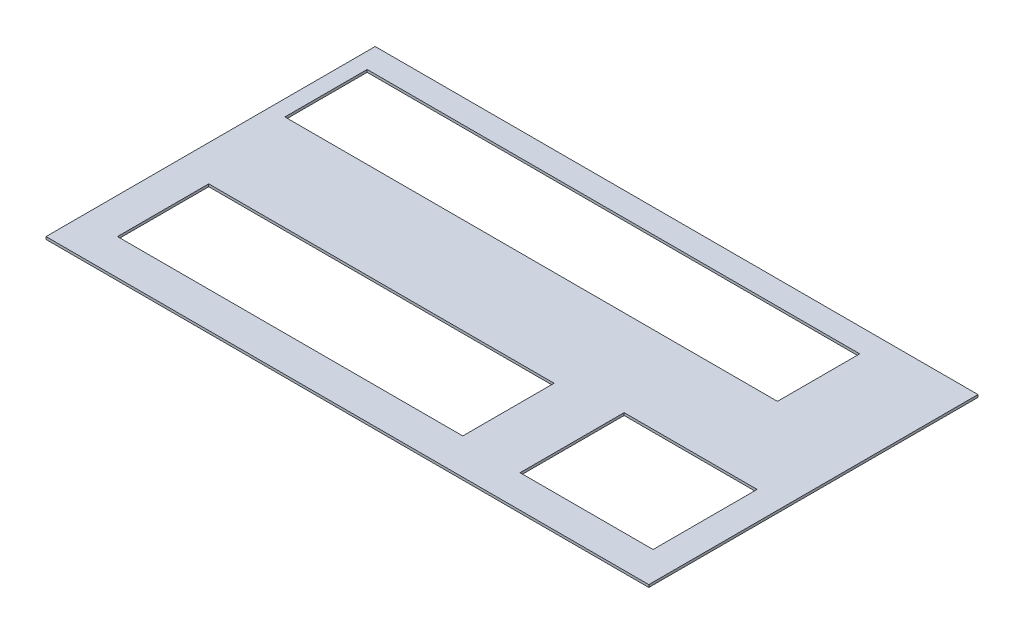
ISO-10303-21;
HEADER;
FILE_DESCRIPTION(('STEP AP214'),'2;1');
FILE_NAME('part.step','',(''),(''),'','','');
FILE_SCHEMA(('AUTOMOTIVE_DESIGN { 1 0 10303 214 1 1 1 1 }'));
ENDSEC;
DATA;
#1=APPLICATION_CONTEXT('core data for automotive mechanical design processes');
#2=APPLICATION_PROTOCOL_DEFINITION('international standard','automotive_design',2000,#1);
#3=PRODUCT_CONTEXT('',#1,'mechanical');
#4=PRODUCT('Part','Part','',(#3));
#5=PRODUCT_RELATED_PRODUCT_CATEGORY('part','',(#4));
#6=PRODUCT_DEFINITION_FORMATION('','',#4);
#7=PRODUCT_DEFINITION_CONTEXT('part definition',#1,'design');
#8=PRODUCT_DEFINITION('design','',#6,#7);
#9=PRODUCT_DEFINITION_SHAPE('','',#8);
#10=(LENGTH_UNIT() NAMED_UNIT(*) SI_UNIT(.MILLI.,.METRE.));
#11=(NAMED_UNIT(*) PLANE_ANGLE_UNIT() SI_UNIT($,.RADIAN.));
#12=(NAMED_UNIT(*) SI_UNIT($,.STERADIAN.) SOLID_ANGLE_UNIT());
#13=UNCERTAINTY_MEASURE_WITH_UNIT(LENGTH_MEASURE(1.E-05),#10,'distance_accuracy_value','');
#14=(GEOMETRIC_REPRESENTATION_CONTEXT(3) GLOBAL_UNCERTAINTY_ASSIGNED_CONTEXT((#13)) GLOBAL_UNIT_ASSIGNED_CONTEXT((#10,
#11,#12)) REPRESENTATION_CONTEXT('',''));
#15=CARTESIAN_POINT('',(0.,0.,0.));
#16=DIRECTION('',(0.,0.,1.));
#17=DIRECTION('',(1.,0.,0.));
#18=AXIS2_PLACEMENT_3D('',#15,#16,#17);
#19=CARTESIAN_POINT('',(0.,6.35,0.));
#20=DIRECTION('',(1.,0.,0.));
#21=DIRECTION('',(0.,0.,-1.));
#22=AXIS2_PLACEMENT_3D('',#19,#20,#21);
#23=PLANE('',#22);
#24=DIRECTION('',(0.,0.,1.));
#25=VECTOR('',#24,1.);
#26=CARTESIAN_POINT('',(0.,0.,0.));
#27=LINE('',#26,#25);
#28=CARTESIAN_POINT('',(0.,0.,-829.31));
#29=VERTEX_POINT('',#28);
#30=CARTESIAN_POINT('',(0.,0.,0.));
#31=VERTEX_POINT('',#30);
#32=EDGE_CURVE('E283',#29,#31,#27,.T.);
#33=ORIENTED_EDGE('',*,*,#32,.T.);
#34=DIRECTION('',(0.,-1.,0.));
#35=VECTOR('',#34,1.);
#36=CARTESIAN_POINT('',(0.,6.35,0.));
#37=LINE('',#36,#35);
#38=CARTESIAN_POINT('',(0.,6.35,0.));
#39=VERTEX_POINT('',#38);
#40=EDGE_CURVE('E11',#39,#31,#37,.T.);
#41=ORIENTED_EDGE('',*,*,#40,.F.);
#42=DIRECTION('',(0.,0.,1.));
#43=VECTOR('',#42,1.);
#44=CARTESIAN_POINT('',(0.,6.35,0.));
#45=LINE('',#44,#43);
#46=CARTESIAN_POINT('',(0.,6.35,-829.31));
#47=VERTEX_POINT('',#46);
#48=EDGE_CURVE('E284',#47,#39,#45,.T.);
#49=ORIENTED_EDGE('',*,*,#48,.F.);
#50=DIRECTION('',(0.,-1.,0.));
#51=VECTOR('',#50,1.);
#52=CARTESIAN_POINT('',(0.,6.35,-829.31));
#53=LINE('',#52,#51);
#54=EDGE_CURVE('E298',#47,#29,#53,.T.);
#55=ORIENTED_EDGE('',*,*,#54,.T.);
#56=EDGE_LOOP('',(#33,#41,#49,#55));
#57=FACE_BOUND('',#56,.T.);
#58=ADVANCED_FACE('F42',(#57),#23,.F.);
#59=CARTESIAN_POINT('',(0.,6.35,0.));
#60=DIRECTION('',(0.,0.,-1.));
#61=DIRECTION('',(-1.,0.,0.));
#62=AXIS2_PLACEMENT_3D('',#59,#60,#61);
#63=PLANE('',#62);
#64=DIRECTION('',(1.,0.,0.));
#65=VECTOR('',#64,1.);
#66=CARTESIAN_POINT('',(0.,0.,0.));
#67=LINE('',#66,#65);
#68=CARTESIAN_POINT('',(1518.68,0.,0.));
#69=VERTEX_POINT('',#68);
#70=EDGE_CURVE('E302',#31,#69,#67,.T.);
#71=ORIENTED_EDGE('',*,*,#70,.T.);
#72=DIRECTION('',(0.,-1.,0.));
#73=VECTOR('',#72,1.);
#74=CARTESIAN_POINT('',(1518.68,6.35,0.));
#75=LINE('',#74,#73);
#76=CARTESIAN_POINT('',(1518.68,6.35,0.));
#77=VERTEX_POINT('',#76);
#78=EDGE_CURVE('E50',#77,#69,#75,.T.);
#79=ORIENTED_EDGE('',*,*,#78,.F.);
#80=DIRECTION('',(1.,0.,0.));
#81=VECTOR('',#80,1.);
#82=CARTESIAN_POINT('',(0.,6.35,0.));
#83=LINE('',#82,#81);
#84=EDGE_CURVE('E288',#39,#77,#83,.T.);
#85=ORIENTED_EDGE('',*,*,#84,.F.);
#86=ORIENTED_EDGE('',*,*,#40,.T.);
#87=EDGE_LOOP('',(#71,#79,#85,#86));
#88=FACE_BOUND('',#87,.T.);
#89=ADVANCED_FACE('F337',(#88),#63,.F.);
#90=CARTESIAN_POINT('',(1518.68,6.35,0.));
#91=DIRECTION('',(-1.,0.,0.));
#92=DIRECTION('',(0.,0.,1.));
#93=AXIS2_PLACEMENT_3D('',#90,#91,#92);
#94=PLANE('',#93);
#95=DIRECTION('',(0.,0.,-1.));
#96=VECTOR('',#95,1.);
#97=CARTESIAN_POINT('',(1518.68,0.,0.));
#98=LINE('',#97,#96);
#99=CARTESIAN_POINT('',(1518.68,0.,-829.31));
#100=VERTEX_POINT('',#99);
#101=EDGE_CURVE('E305',#69,#100,#98,.T.);
#102=ORIENTED_EDGE('',*,*,#101,.T.);
#103=DIRECTION('',(0.,-1.,0.));
#104=VECTOR('',#103,1.);
#105=CARTESIAN_POINT('',(1518.68,6.35,-829.31));
#106=LINE('',#105,#104);
#107=CARTESIAN_POINT('',(1518.68,6.35,-829.31));
#108=VERTEX_POINT('',#107);
#109=EDGE_CURVE('E313',#108,#100,#106,.T.);
#110=ORIENTED_EDGE('',*,*,#109,.F.);
#111=DIRECTION('',(0.,0.,-1.));
#112=VECTOR('',#111,1.);
#113=CARTESIAN_POINT('',(1518.68,6.35,0.));
#114=LINE('',#113,#112);
#115=EDGE_CURVE('E292',#77,#108,#114,.T.);
#116=ORIENTED_EDGE('',*,*,#115,.F.);
#117=ORIENTED_EDGE('',*,*,#78,.T.);
#118=EDGE_LOOP('',(#102,#110,#116,#117));
#119=FACE_BOUND('',#118,.T.);
#120=ADVANCED_FACE('F322',(#119),#94,.F.);
#121=CARTESIAN_POINT('',(0.,6.35,-829.31));
#122=DIRECTION('',(0.,0.,1.));
#123=DIRECTION('',(1.,0.,0.));
#124=AXIS2_PLACEMENT_3D('',#121,#122,#123);
#125=PLANE('',#124);
#126=DIRECTION('',(-1.,0.,0.));
#127=VECTOR('',#126,1.);
#128=CARTESIAN_POINT('',(0.,0.,-829.31));
#129=LINE('',#128,#127);
#130=EDGE_CURVE('E289',#100,#29,#129,.T.);
#131=ORIENTED_EDGE('',*,*,#130,.T.);
#132=ORIENTED_EDGE('',*,*,#54,.F.);
#133=DIRECTION('',(-1.,0.,0.));
#134=VECTOR('',#133,1.);
#135=CARTESIAN_POINT('',(0.,6.35,-829.31));
#136=LINE('',#135,#134);
#137=EDGE_CURVE('E295',#108,#47,#136,.T.);
#138=ORIENTED_EDGE('',*,*,#137,.F.);
#139=ORIENTED_EDGE('',*,*,#109,.T.);
#140=EDGE_LOOP('',(#131,#132,#138,#139));
#141=FACE_BOUND('',#140,.T.);
#142=ADVANCED_FACE('F331',(#141),#125,.F.);
#143=CARTESIAN_POINT('',(0.,6.35,0.));
#144=DIRECTION('',(0.,-1.,0.));
#145=DIRECTION('',(0.,0.,-1.));
#146=AXIS2_PLACEMENT_3D('',#143,#144,#145);
#147=PLANE('',#146);
#148=DIRECTION('',(-1.,0.,0.));
#149=VECTOR('',#148,1.);
#150=CARTESIAN_POINT('',(1447.49725581819,6.35,-344.135446274477));
#151=LINE('',#150,#149);
#152=CARTESIAN_POINT('',(1447.49725581819,6.35,-344.135446274477));
#153=VERTEX_POINT('',#152);
#154=CARTESIAN_POINT('',(1112.41105422309,6.35,-344.135446274477));
#155=VERTEX_POINT('',#154);
#156=EDGE_CURVE('E222',#153,#155,#151,.T.);
#157=ORIENTED_EDGE('',*,*,#156,.F.);
#158=DIRECTION('',(0.,0.,-1.));
#159=VECTOR('',#158,1.);
#160=CARTESIAN_POINT('',(1447.49725581819,6.35,-344.135446274477));
#161=LINE('',#160,#159);
#162=CARTESIAN_POINT('',(1447.49725581819,6.35,-81.9352263822639));
#163=VERTEX_POINT('',#162);
#164=EDGE_CURVE('E57',#163,#153,#161,.T.);
#165=ORIENTED_EDGE('',*,*,#164,.F.);
#166=DIRECTION('',(1.,0.,0.));
#167=VECTOR('',#166,1.);
#168=CARTESIAN_POINT('',(1447.49725581819,6.35,-81.9352263822639));
#169=LINE('',#168,#167);
#170=CARTESIAN_POINT('',(1112.41105422309,6.35,-81.9352263822639));
#171=VERTEX_POINT('',#170);
#172=EDGE_CURVE('E206',#171,#163,#169,.T.);
#173=ORIENTED_EDGE('',*,*,#172,.F.);
#174=DIRECTION('',(0.,0.,1.));
#175=VECTOR('',#174,1.);
#176=CARTESIAN_POINT('',(1112.41105422309,6.35,-344.135446274477));
#177=LINE('',#176,#175);
#178=EDGE_CURVE('E218',#155,#171,#177,.T.);
#179=ORIENTED_EDGE('',*,*,#178,.F.);
#180=EDGE_LOOP('',(#157,#165,#173,#179));
#181=FACE_BOUND('',#180,.T.);
#182=DIRECTION('',(1.,0.,0.));
#183=VECTOR('',#182,1.);
#184=CARTESIAN_POINT('',(39.9458948805705,6.35,-561.846820192199));
#185=LINE('',#184,#183);
#186=CARTESIAN_POINT('',(39.9458948805705,6.35,-561.846820192199));
#187=VERTEX_POINT('',#186);
#188=CARTESIAN_POINT('',(1280.90072621159,6.35,-561.846820192199));
#189=VERTEX_POINT('',#188);
#190=EDGE_CURVE('E181',#187,#189,#185,.T.);
#191=ORIENTED_EDGE('',*,*,#190,.F.);
#192=DIRECTION('',(0.,0.,1.));
#193=VECTOR('',#192,1.);
#194=CARTESIAN_POINT('',(39.9458948805705,6.35,-769.145911009508));
#195=LINE('',#194,#193);
#196=CARTESIAN_POINT('',(39.9458948805705,6.35,-769.145911009508));
#197=VERTEX_POINT('',#196);
#198=EDGE_CURVE('E65',#197,#187,#195,.T.);
#199=ORIENTED_EDGE('',*,*,#198,.F.);
#200=DIRECTION('',(-1.,0.,0.));
#201=VECTOR('',#200,1.);
#202=CARTESIAN_POINT('',(39.9458948805705,6.35,-769.145911009508));
#203=LINE('',#202,#201);
#204=CARTESIAN_POINT('',(1280.90072621159,6.35,-769.145911009508));
#205=VERTEX_POINT('',#204);
#206=EDGE_CURVE('E167',#205,#197,#203,.T.);
#207=ORIENTED_EDGE('',*,*,#206,.F.);
#208=DIRECTION('',(0.,0.,-1.));
#209=VECTOR('',#208,1.);
#210=CARTESIAN_POINT('',(1280.90072621159,6.35,-769.145911009508));
#211=LINE('',#210,#209);
#212=EDGE_CURVE('E174',#189,#205,#211,.T.);
#213=ORIENTED_EDGE('',*,*,#212,.F.);
#214=EDGE_LOOP('',(#191,#199,#207,#213));
#215=FACE_BOUND('',#214,.T.);
#216=DIRECTION('',(1.,0.,0.));
#217=VECTOR('',#216,1.);
#218=CARTESIAN_POINT('',(89.9999999999999,6.35,-90.));
#219=LINE('',#218,#217);
#220=CARTESIAN_POINT('',(89.9999999999999,6.35,-90.));
#221=VERTEX_POINT('',#220);
#222=CARTESIAN_POINT('',(960.,6.35,-90.));
#223=VERTEX_POINT('',#222);
#224=EDGE_CURVE('E254',#221,#223,#219,.T.);
#225=ORIENTED_EDGE('',*,*,#224,.F.);
#226=DIRECTION('',(0.,0.,1.));
#227=VECTOR('',#226,1.);
#228=CARTESIAN_POINT('',(89.9999999999999,6.35,-90.));
#229=LINE('',#228,#227);
#230=CARTESIAN_POINT('',(90.,6.35,-320.));
#231=VERTEX_POINT('',#230);
#232=EDGE_CURVE('E251',#231,#221,#229,.T.);
#233=ORIENTED_EDGE('',*,*,#232,.F.);
#234=DIRECTION('',(-1.,0.,0.));
#235=VECTOR('',#234,1.);
#236=CARTESIAN_POINT('',(90.,6.35,-320.));
#237=LINE('',#236,#235);
#238=CARTESIAN_POINT('',(960.,6.35,-320.));
#239=VERTEX_POINT('',#238);
#240=EDGE_CURVE('E262',#239,#231,#237,.T.);
#241=ORIENTED_EDGE('',*,*,#240,.F.);
#242=DIRECTION('',(0.,0.,-1.));
#243=VECTOR('',#242,1.);
#244=CARTESIAN_POINT('',(960.,6.35,-90.));
#245=LINE('',#244,#243);
#246=EDGE_CURVE('E258',#223,#239,#245,.T.);
#247=ORIENTED_EDGE('',*,*,#246,.F.);
#248=EDGE_LOOP('',(#225,#233,#241,#247));
#249=FACE_BOUND('',#248,.T.);
#250=ORIENTED_EDGE('',*,*,#48,.T.);
#251=ORIENTED_EDGE('',*,*,#84,.T.);
#252=ORIENTED_EDGE('',*,*,#115,.T.);
#253=ORIENTED_EDGE('',*,*,#137,.T.);
#254=EDGE_LOOP('',(#250,#251,#252,#253));
#255=FACE_BOUND('',#254,.T.);
#256=ADVANCED_FACE('F178',(#181,#215,#249,#255),#147,.F.);
#257=CARTESIAN_POINT('',(0.,0.,0.));
#258=DIRECTION('',(0.,-1.,0.));
#259=DIRECTION('',(0.,0.,-1.));
#260=AXIS2_PLACEMENT_3D('',#257,#258,#259);
#261=PLANE('',#260);
#262=DIRECTION('',(0.,0.,-1.));
#263=VECTOR('',#262,1.);
#264=CARTESIAN_POINT('',(1447.49725581819,0.,-344.135446274477));
#265=LINE('',#264,#263);
#266=CARTESIAN_POINT('',(1447.49725581819,0.,-81.9352263822639));
#267=VERTEX_POINT('',#266);
#268=CARTESIAN_POINT('',(1447.49725581819,0.,-344.135446274477));
#269=VERTEX_POINT('',#268);
#270=EDGE_CURVE('E228',#267,#269,#265,.T.);
#271=ORIENTED_EDGE('',*,*,#270,.T.);
#272=DIRECTION('',(-1.,0.,0.));
#273=VECTOR('',#272,1.);
#274=CARTESIAN_POINT('',(1447.49725581819,0.,-344.135446274477));
#275=LINE('',#274,#273);
#276=CARTESIAN_POINT('',(1112.41105422309,0.,-344.135446274477));
#277=VERTEX_POINT('',#276);
#278=EDGE_CURVE('E198',#269,#277,#275,.T.);
#279=ORIENTED_EDGE('',*,*,#278,.T.);
#280=DIRECTION('',(0.,0.,1.));
#281=VECTOR('',#280,1.);
#282=CARTESIAN_POINT('',(1112.41105422309,0.,-344.135446274477));
#283=LINE('',#282,#281);
#284=CARTESIAN_POINT('',(1112.41105422309,0.,-81.9352263822639));
#285=VERTEX_POINT('',#284);
#286=EDGE_CURVE('E236',#277,#285,#283,.T.);
#287=ORIENTED_EDGE('',*,*,#286,.T.);
#288=DIRECTION('',(1.,0.,0.));
#289=VECTOR('',#288,1.);
#290=CARTESIAN_POINT('',(1447.49725581819,0.,-81.9352263822639));
#291=LINE('',#290,#289);
#292=EDGE_CURVE('E232',#285,#267,#291,.T.);
#293=ORIENTED_EDGE('',*,*,#292,.T.);
#294=EDGE_LOOP('',(#271,#279,#287,#293));
#295=FACE_BOUND('',#294,.T.);
#296=DIRECTION('',(0.,0.,1.));
#297=VECTOR('',#296,1.);
#298=CARTESIAN_POINT('',(39.9458948805705,0.,-769.145911009508));
#299=LINE('',#298,#297);
#300=CARTESIAN_POINT('',(39.9458948805705,0.,-769.145911009508));
#301=VERTEX_POINT('',#300);
#302=CARTESIAN_POINT('',(39.9458948805705,0.,-561.846820192199));
#303=VERTEX_POINT('',#302);
#304=EDGE_CURVE('E159',#301,#303,#299,.T.);
#305=ORIENTED_EDGE('',*,*,#304,.T.);
#306=DIRECTION('',(1.,0.,0.));
#307=VECTOR('',#306,1.);
#308=CARTESIAN_POINT('',(39.9458948805705,0.,-561.846820192199));
#309=LINE('',#308,#307);
#310=CARTESIAN_POINT('',(1280.90072621159,0.,-561.846820192199));
#311=VERTEX_POINT('',#310);
#312=EDGE_CURVE('E164',#303,#311,#309,.T.);
#313=ORIENTED_EDGE('',*,*,#312,.T.);
#314=DIRECTION('',(0.,0.,-1.));
#315=VECTOR('',#314,1.);
#316=CARTESIAN_POINT('',(1280.90072621159,0.,-769.145911009508));
#317=LINE('',#316,#315);
#318=CARTESIAN_POINT('',(1280.90072621159,0.,-769.145911009508));
#319=VERTEX_POINT('',#318);
#320=EDGE_CURVE('E193',#311,#319,#317,.T.);
#321=ORIENTED_EDGE('',*,*,#320,.T.);
#322=DIRECTION('',(-1.,0.,0.));
#323=VECTOR('',#322,1.);
#324=CARTESIAN_POINT('',(39.9458948805705,0.,-769.145911009508));
#325=LINE('',#324,#323);
#326=EDGE_CURVE('E186',#319,#301,#325,.T.);
#327=ORIENTED_EDGE('',*,*,#326,.T.);
#328=EDGE_LOOP('',(#305,#313,#321,#327));
#329=FACE_BOUND('',#328,.T.);
#330=DIRECTION('',(0.,0.,1.));
#331=VECTOR('',#330,1.);
#332=CARTESIAN_POINT('',(89.9999999999999,0.,-90.));
#333=LINE('',#332,#331);
#334=CARTESIAN_POINT('',(90.,0.,-320.));
#335=VERTEX_POINT('',#334);
#336=CARTESIAN_POINT('',(89.9999999999999,0.,-90.));
#337=VERTEX_POINT('',#336);
#338=EDGE_CURVE('E247',#335,#337,#333,.T.);
#339=ORIENTED_EDGE('',*,*,#338,.T.);
#340=DIRECTION('',(1.,0.,0.));
#341=VECTOR('',#340,1.);
#342=CARTESIAN_POINT('',(89.9999999999999,0.,-90.));
#343=LINE('',#342,#341);
#344=CARTESIAN_POINT('',(960.,0.,-90.));
#345=VERTEX_POINT('',#344);
#346=EDGE_CURVE('E270',#337,#345,#343,.T.);
#347=ORIENTED_EDGE('',*,*,#346,.T.);
#348=DIRECTION('',(0.,0.,-1.));
#349=VECTOR('',#348,1.);
#350=CARTESIAN_POINT('',(960.,0.,-90.));
#351=LINE('',#350,#349);
#352=CARTESIAN_POINT('',(960.,0.,-320.));
#353=VERTEX_POINT('',#352);
#354=EDGE_CURVE('E197',#345,#353,#351,.T.);
#355=ORIENTED_EDGE('',*,*,#354,.T.);
#356=DIRECTION('',(-1.,0.,0.));
#357=VECTOR('',#356,1.);
#358=CARTESIAN_POINT('',(90.,0.,-320.));
#359=LINE('',#358,#357);
#360=EDGE_CURVE('E243',#353,#335,#359,.T.);
#361=ORIENTED_EDGE('',*,*,#360,.T.);
#362=EDGE_LOOP('',(#339,#347,#355,#361));
#363=FACE_BOUND('',#362,.T.);
#364=ORIENTED_EDGE('',*,*,#32,.F.);
#365=ORIENTED_EDGE('',*,*,#130,.F.);
#366=ORIENTED_EDGE('',*,*,#101,.F.);
#367=ORIENTED_EDGE('',*,*,#70,.F.);
#368=EDGE_LOOP('',(#364,#365,#366,#367));
#369=FACE_BOUND('',#368,.T.);
#370=ADVANCED_FACE('F328',(#295,#329,#363,#369),#261,.T.);
#371=CARTESIAN_POINT('',(89.9999999999999,-0.00100000000000013,-90.));
#372=DIRECTION('',(-1.,0.,0.));
#373=DIRECTION('',(0.,0.,1.));
#374=AXIS2_PLACEMENT_3D('',#371,#372,#373);
#375=PLANE('',#374);
#376=DIRECTION('',(0.,1.,0.));
#377=VECTOR('',#376,1.);
#378=CARTESIAN_POINT('',(90.,-0.00100000000000013,-320.));
#379=LINE('',#378,#377);
#380=EDGE_CURVE('E267',#335,#231,#379,.T.);
#381=ORIENTED_EDGE('',*,*,#380,.T.);
#382=ORIENTED_EDGE('',*,*,#232,.T.);
#383=DIRECTION('',(0.,1.,0.));
#384=VECTOR('',#383,1.);
#385=CARTESIAN_POINT('',(89.9999999999999,-0.00100000000000013,-90.));
#386=LINE('',#385,#384);
#387=EDGE_CURVE('E266',#337,#221,#386,.T.);
#388=ORIENTED_EDGE('',*,*,#387,.F.);
#389=ORIENTED_EDGE('',*,*,#338,.F.);
#390=EDGE_LOOP('',(#381,#382,#388,#389));
#391=FACE_BOUND('',#390,.T.);
#392=ADVANCED_FACE('F349',(#391),#375,.F.);
#393=CARTESIAN_POINT('',(90.,-0.00100000000000013,-320.));
#394=DIRECTION('',(0.,0.,-1.));
#395=DIRECTION('',(-1.,0.,0.));
#396=AXIS2_PLACEMENT_3D('',#393,#394,#395);
#397=PLANE('',#396);
#398=DIRECTION('',(0.,1.,0.));
#399=VECTOR('',#398,1.);
#400=CARTESIAN_POINT('',(960.,-0.00100000000000013,-320.));
#401=LINE('',#400,#399);
#402=EDGE_CURVE('E271',#353,#239,#401,.T.);
#403=ORIENTED_EDGE('',*,*,#402,.T.);
#404=ORIENTED_EDGE('',*,*,#240,.T.);
#405=ORIENTED_EDGE('',*,*,#380,.F.);
#406=ORIENTED_EDGE('',*,*,#360,.F.);
#407=EDGE_LOOP('',(#403,#404,#405,#406));
#408=FACE_BOUND('',#407,.T.);
#409=ADVANCED_FACE('F356',(#408),#397,.F.);
#410=CARTESIAN_POINT('',(960.,-0.00100000000000013,-90.));
#411=DIRECTION('',(1.,0.,0.));
#412=DIRECTION('',(0.,0.,-1.));
#413=AXIS2_PLACEMENT_3D('',#410,#411,#412);
#414=PLANE('',#413);
#415=DIRECTION('',(0.,1.,0.));
#416=VECTOR('',#415,1.);
#417=CARTESIAN_POINT('',(960.,-0.00100000000000013,-90.));
#418=LINE('',#417,#416);
#419=EDGE_CURVE('E274',#345,#223,#418,.T.);
#420=ORIENTED_EDGE('',*,*,#419,.T.);
#421=ORIENTED_EDGE('',*,*,#246,.T.);
#422=ORIENTED_EDGE('',*,*,#402,.F.);
#423=ORIENTED_EDGE('',*,*,#354,.F.);
#424=EDGE_LOOP('',(#420,#421,#422,#423));
#425=FACE_BOUND('',#424,.T.);
#426=ADVANCED_FACE('F361',(#425),#414,.F.);
#427=CARTESIAN_POINT('',(89.9999999999999,-0.00100000000000013,-90.));
#428=DIRECTION('',(0.,0.,1.));
#429=DIRECTION('',(1.,0.,0.));
#430=AXIS2_PLACEMENT_3D('',#427,#428,#429);
#431=PLANE('',#430);
#432=ORIENTED_EDGE('',*,*,#387,.T.);
#433=ORIENTED_EDGE('',*,*,#224,.T.);
#434=ORIENTED_EDGE('',*,*,#419,.F.);
#435=ORIENTED_EDGE('',*,*,#346,.F.);
#436=EDGE_LOOP('',(#432,#433,#434,#435));
#437=FACE_BOUND('',#436,.T.);
#438=ADVANCED_FACE('F358',(#437),#431,.F.);
#439=CARTESIAN_POINT('',(39.9458948805705,-0.00100000000000013,-769.145911009508));
#440=DIRECTION('',(-1.,0.,0.));
#441=DIRECTION('',(0.,0.,1.));
#442=AXIS2_PLACEMENT_3D('',#439,#440,#441);
#443=PLANE('',#442);
#444=DIRECTION('',(0.,1.,0.));
#445=VECTOR('',#444,1.);
#446=CARTESIAN_POINT('',(39.9458948805705,-0.00100000000000013,-769.145911009508));
#447=LINE('',#446,#445);
#448=EDGE_CURVE('E155',#301,#197,#447,.T.);
#449=ORIENTED_EDGE('',*,*,#448,.T.);
#450=ORIENTED_EDGE('',*,*,#198,.T.);
#451=DIRECTION('',(0.,1.,0.));
#452=VECTOR('',#451,1.);
#453=CARTESIAN_POINT('',(39.9458948805705,-0.00100000000000013,-561.846820192199));
#454=LINE('',#453,#452);
#455=EDGE_CURVE('E175',#303,#187,#454,.T.);
#456=ORIENTED_EDGE('',*,*,#455,.F.);
#457=ORIENTED_EDGE('',*,*,#304,.F.);
#458=EDGE_LOOP('',(#449,#450,#456,#457));
#459=FACE_BOUND('',#458,.T.);
#460=ADVANCED_FACE('F157',(#459),#443,.F.);
#461=CARTESIAN_POINT('',(39.9458948805705,-0.00100000000000013,-769.145911009508));
#462=DIRECTION('',(0.,0.,-1.));
#463=DIRECTION('',(-1.,0.,0.));
#464=AXIS2_PLACEMENT_3D('',#461,#462,#463);
#465=PLANE('',#464);
#466=DIRECTION('',(0.,1.,0.));
#467=VECTOR('',#466,1.);
#468=CARTESIAN_POINT('',(1280.90072621159,-0.00100000000000013,-769.145911009508));
#469=LINE('',#468,#467);
#470=EDGE_CURVE('E163',#319,#205,#469,.T.);
#471=ORIENTED_EDGE('',*,*,#470,.T.);
#472=ORIENTED_EDGE('',*,*,#206,.T.);
#473=ORIENTED_EDGE('',*,*,#448,.F.);
#474=ORIENTED_EDGE('',*,*,#326,.F.);
#475=EDGE_LOOP('',(#471,#472,#473,#474));
#476=FACE_BOUND('',#475,.T.);
#477=ADVANCED_FACE('F168',(#476),#465,.F.);
#478=CARTESIAN_POINT('',(1280.90072621159,-0.00100000000000013,-769.145911009508));
#479=DIRECTION('',(1.,0.,0.));
#480=DIRECTION('',(0.,0.,-1.));
#481=AXIS2_PLACEMENT_3D('',#478,#479,#480);
#482=PLANE('',#481);
#483=DIRECTION('',(0.,1.,0.));
#484=VECTOR('',#483,1.);
#485=CARTESIAN_POINT('',(1280.90072621159,-0.00100000000000013,-561.846820192199));
#486=LINE('',#485,#484);
#487=EDGE_CURVE('E539',#311,#189,#486,.T.);
#488=ORIENTED_EDGE('',*,*,#487,.T.);
#489=ORIENTED_EDGE('',*,*,#212,.T.);
#490=ORIENTED_EDGE('',*,*,#470,.F.);
#491=ORIENTED_EDGE('',*,*,#320,.F.);
#492=EDGE_LOOP('',(#488,#489,#490,#491));
#493=FACE_BOUND('',#492,.T.);
#494=ADVANCED_FACE('F387',(#493),#482,.F.);
#495=CARTESIAN_POINT('',(39.9458948805705,-0.00100000000000013,-561.846820192199));
#496=DIRECTION('',(0.,0.,1.));
#497=DIRECTION('',(1.,0.,0.));
#498=AXIS2_PLACEMENT_3D('',#495,#496,#497);
#499=PLANE('',#498);
#500=ORIENTED_EDGE('',*,*,#455,.T.);
#501=ORIENTED_EDGE('',*,*,#190,.T.);
#502=ORIENTED_EDGE('',*,*,#487,.F.);
#503=ORIENTED_EDGE('',*,*,#312,.F.);
#504=EDGE_LOOP('',(#500,#501,#502,#503));
#505=FACE_BOUND('',#504,.T.);
#506=ADVANCED_FACE('F384',(#505),#499,.F.);
#507=CARTESIAN_POINT('',(1447.49725581819,-0.00100000000000013,-344.135446274477));
#508=DIRECTION('',(1.,0.,0.));
#509=DIRECTION('',(0.,0.,-1.));
#510=AXIS2_PLACEMENT_3D('',#507,#508,#509);
#511=PLANE('',#510);
#512=DIRECTION('',(0.,1.,0.));
#513=VECTOR('',#512,1.);
#514=CARTESIAN_POINT('',(1447.49725581819,-0.00100000000000013,-81.9352263822639));
#515=LINE('',#514,#513);
#516=EDGE_CURVE('E202',#267,#163,#515,.T.);
#517=ORIENTED_EDGE('',*,*,#516,.T.);
#518=ORIENTED_EDGE('',*,*,#164,.T.);
#519=DIRECTION('',(0.,1.,0.));
#520=VECTOR('',#519,1.);
#521=CARTESIAN_POINT('',(1447.49725581819,-0.00100000000000013,-344.135446274477));
#522=LINE('',#521,#520);
#523=EDGE_CURVE('E203',#269,#153,#522,.T.);
#524=ORIENTED_EDGE('',*,*,#523,.F.);
#525=ORIENTED_EDGE('',*,*,#270,.F.);
#526=EDGE_LOOP('',(#517,#518,#524,#525));
#527=FACE_BOUND('',#526,.T.);
#528=ADVANCED_FACE('F373',(#527),#511,.F.);
#529=CARTESIAN_POINT('',(1447.49725581819,-0.00100000000000013,-81.9352263822639));
#530=DIRECTION('',(0.,0.,1.));
#531=DIRECTION('',(1.,0.,0.));
#532=AXIS2_PLACEMENT_3D('',#529,#530,#531);
#533=PLANE('',#532);
#534=DIRECTION('',(0.,1.,0.));
#535=VECTOR('',#534,1.);
#536=CARTESIAN_POINT('',(1112.41105422309,-0.00100000000000013,-81.9352263822639));
#537=LINE('',#536,#535);
#538=EDGE_CURVE('E210',#285,#171,#537,.T.);
#539=ORIENTED_EDGE('',*,*,#538,.T.);
#540=ORIENTED_EDGE('',*,*,#172,.T.);
#541=ORIENTED_EDGE('',*,*,#516,.F.);
#542=ORIENTED_EDGE('',*,*,#292,.F.);
#543=EDGE_LOOP('',(#539,#540,#541,#542));
#544=FACE_BOUND('',#543,.T.);
#545=ADVANCED_FACE('F369',(#544),#533,.F.);
#546=CARTESIAN_POINT('',(1112.41105422309,-0.00100000000000013,-344.135446274477));
#547=DIRECTION('',(-1.,0.,0.));
#548=DIRECTION('',(0.,0.,1.));
#549=AXIS2_PLACEMENT_3D('',#546,#547,#548);
#550=PLANE('',#549);
#551=DIRECTION('',(0.,1.,0.));
#552=VECTOR('',#551,1.);
#553=CARTESIAN_POINT('',(1112.41105422309,-0.00100000000000013,-344.135446274477));
#554=LINE('',#553,#552);
#555=EDGE_CURVE('E207',#277,#155,#554,.T.);
#556=ORIENTED_EDGE('',*,*,#555,.T.);
#557=ORIENTED_EDGE('',*,*,#178,.T.);
#558=ORIENTED_EDGE('',*,*,#538,.F.);
#559=ORIENTED_EDGE('',*,*,#286,.F.);
#560=EDGE_LOOP('',(#556,#557,#558,#559));
#561=FACE_BOUND('',#560,.T.);
#562=ADVANCED_FACE('F372',(#561),#550,.F.);
#563=CARTESIAN_POINT('',(1447.49725581819,-0.00100000000000013,-344.135446274477));
#564=DIRECTION('',(0.,0.,-1.));
#565=DIRECTION('',(-1.,0.,0.));
#566=AXIS2_PLACEMENT_3D('',#563,#564,#565);
#567=PLANE('',#566);
#568=ORIENTED_EDGE('',*,*,#523,.T.);
#569=ORIENTED_EDGE('',*,*,#156,.T.);
#570=ORIENTED_EDGE('',*,*,#555,.F.);
#571=ORIENTED_EDGE('',*,*,#278,.F.);
#572=EDGE_LOOP('',(#568,#569,#570,#571));
#573=FACE_BOUND('',#572,.T.);
#574=ADVANCED_FACE('F377',(#573),#567,.F.);
#575=CLOSED_SHELL('',(#58,#89,#120,#142,#256,#370,#392,#409,#426,#438,#460,#477,#494,#506,#528,
#545,#562,#574));
#576=MANIFOLD_SOLID_BREP('B2',#575);
#577=ADVANCED_BREP_SHAPE_REPRESENTATION('',(#18,#576),#14);
#578=SHAPE_DEFINITION_REPRESENTATION(#9,#577);
ENDSEC;
END-ISO-10303-21;
